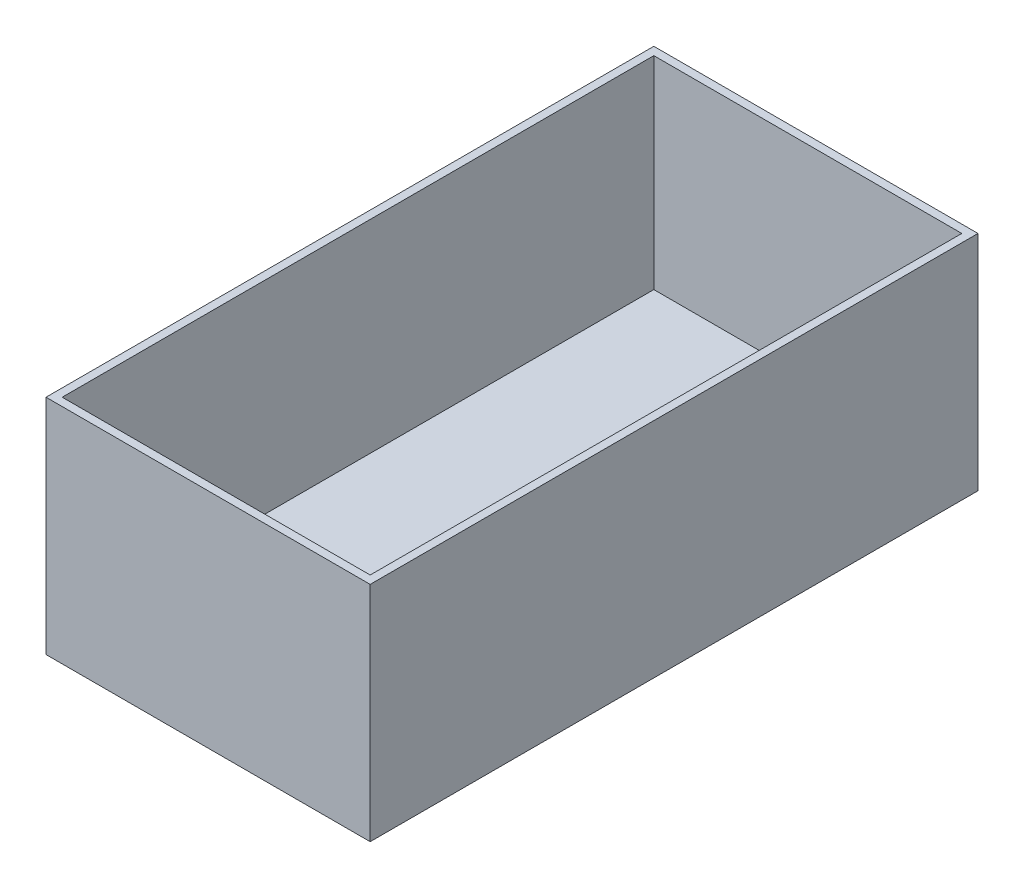
ISO-10303-21;
HEADER;
FILE_DESCRIPTION(('STEP AP214'),'2;1');
FILE_NAME('part.step','',(''),(''),'','','');
FILE_SCHEMA(('AUTOMOTIVE_DESIGN { 1 0 10303 214 1 1 1 1 }'));
ENDSEC;
DATA;
#1=APPLICATION_CONTEXT('core data for automotive mechanical design processes');
#2=APPLICATION_PROTOCOL_DEFINITION('international standard','automotive_design',2000,#1);
#3=PRODUCT_CONTEXT('',#1,'mechanical');
#4=PRODUCT('Part','Part','',(#3));
#5=PRODUCT_RELATED_PRODUCT_CATEGORY('part','',(#4));
#6=PRODUCT_DEFINITION_FORMATION('','',#4);
#7=PRODUCT_DEFINITION_CONTEXT('part definition',#1,'design');
#8=PRODUCT_DEFINITION('design','',#6,#7);
#9=PRODUCT_DEFINITION_SHAPE('','',#8);
#10=(LENGTH_UNIT() NAMED_UNIT(*) SI_UNIT(.MILLI.,.METRE.));
#11=(NAMED_UNIT(*) PLANE_ANGLE_UNIT() SI_UNIT($,.RADIAN.));
#12=(NAMED_UNIT(*) SI_UNIT($,.STERADIAN.) SOLID_ANGLE_UNIT());
#13=UNCERTAINTY_MEASURE_WITH_UNIT(LENGTH_MEASURE(1.E-05),#10,'distance_accuracy_value','');
#14=(GEOMETRIC_REPRESENTATION_CONTEXT(3) GLOBAL_UNCERTAINTY_ASSIGNED_CONTEXT((#13)) GLOBAL_UNIT_ASSIGNED_CONTEXT((#10,
#11,#12)) REPRESENTATION_CONTEXT('',''));
#15=CARTESIAN_POINT('',(0.,0.,0.));
#16=DIRECTION('',(0.,0.,1.));
#17=DIRECTION('',(1.,0.,0.));
#18=AXIS2_PLACEMENT_3D('',#15,#16,#17);
#19=CARTESIAN_POINT('',(40.,5.,-75.));
#20=DIRECTION('',(-1.,0.,0.));
#21=DIRECTION('',(0.,0.,1.));
#22=AXIS2_PLACEMENT_3D('',#19,#20,#21);
#23=PLANE('',#22);
#24=DIRECTION('',(0.,0.,-1.));
#25=VECTOR('',#24,1.);
#26=CARTESIAN_POINT('',(40.,0.,-75.));
#27=LINE('',#26,#25);
#28=CARTESIAN_POINT('',(40.,0.,75.));
#29=VERTEX_POINT('',#28);
#30=CARTESIAN_POINT('',(40.,0.,-75.));
#31=VERTEX_POINT('',#30);
#32=EDGE_CURVE('E144',#29,#31,#27,.T.);
#33=ORIENTED_EDGE('',*,*,#32,.T.);
#34=DIRECTION('',(0.,-1.,0.));
#35=VECTOR('',#34,1.);
#36=CARTESIAN_POINT('',(40.,5.,-75.));
#37=LINE('',#36,#35);
#38=CARTESIAN_POINT('',(40.,55.,-75.));
#39=VERTEX_POINT('',#38);
#40=EDGE_CURVE('E11',#39,#31,#37,.T.);
#41=ORIENTED_EDGE('',*,*,#40,.F.);
#42=DIRECTION('',(0.,0.,-1.));
#43=VECTOR('',#42,1.);
#44=CARTESIAN_POINT('',(40.,55.,-75.));
#45=LINE('',#44,#43);
#46=CARTESIAN_POINT('',(40.,55.,75.));
#47=VERTEX_POINT('',#46);
#48=EDGE_CURVE('E138',#47,#39,#45,.T.);
#49=ORIENTED_EDGE('',*,*,#48,.F.);
#50=DIRECTION('',(0.,-1.,0.));
#51=VECTOR('',#50,1.);
#52=CARTESIAN_POINT('',(40.,5.,75.));
#53=LINE('',#52,#51);
#54=EDGE_CURVE('E153',#47,#29,#53,.T.);
#55=ORIENTED_EDGE('',*,*,#54,.T.);
#56=EDGE_LOOP('',(#33,#41,#49,#55));
#57=FACE_BOUND('',#56,.T.);
#58=ADVANCED_FACE('F33',(#57),#23,.F.);
#59=CARTESIAN_POINT('',(-40.,5.,-75.));
#60=DIRECTION('',(0.,0.,1.));
#61=DIRECTION('',(1.,0.,0.));
#62=AXIS2_PLACEMENT_3D('',#59,#60,#61);
#63=PLANE('',#62);
#64=DIRECTION('',(-1.,0.,0.));
#65=VECTOR('',#64,1.);
#66=CARTESIAN_POINT('',(-40.,0.,-75.));
#67=LINE('',#66,#65);
#68=CARTESIAN_POINT('',(-40.,0.,-75.));
#69=VERTEX_POINT('',#68);
#70=EDGE_CURVE('E147',#31,#69,#67,.T.);
#71=ORIENTED_EDGE('',*,*,#70,.T.);
#72=DIRECTION('',(0.,-1.,0.));
#73=VECTOR('',#72,1.);
#74=CARTESIAN_POINT('',(-40.,5.,-75.));
#75=LINE('',#74,#73);
#76=CARTESIAN_POINT('',(-40.,55.,-75.));
#77=VERTEX_POINT('',#76);
#78=EDGE_CURVE('E40',#77,#69,#75,.T.);
#79=ORIENTED_EDGE('',*,*,#78,.F.);
#80=DIRECTION('',(-1.,0.,0.));
#81=VECTOR('',#80,1.);
#82=CARTESIAN_POINT('',(-40.,55.,-75.));
#83=LINE('',#82,#81);
#84=EDGE_CURVE('E141',#39,#77,#83,.T.);
#85=ORIENTED_EDGE('',*,*,#84,.F.);
#86=ORIENTED_EDGE('',*,*,#40,.T.);
#87=EDGE_LOOP('',(#71,#79,#85,#86));
#88=FACE_BOUND('',#87,.T.);
#89=ADVANCED_FACE('F175',(#88),#63,.F.);
#90=CARTESIAN_POINT('',(-40.,5.,-75.));
#91=DIRECTION('',(1.,0.,0.));
#92=DIRECTION('',(0.,0.,-1.));
#93=AXIS2_PLACEMENT_3D('',#90,#91,#92);
#94=PLANE('',#93);
#95=DIRECTION('',(0.,0.,1.));
#96=VECTOR('',#95,1.);
#97=CARTESIAN_POINT('',(-40.,0.,-75.));
#98=LINE('',#97,#96);
#99=CARTESIAN_POINT('',(-40.,0.,75.));
#100=VERTEX_POINT('',#99);
#101=EDGE_CURVE('E149',#69,#100,#98,.T.);
#102=ORIENTED_EDGE('',*,*,#101,.T.);
#103=DIRECTION('',(0.,-1.,0.));
#104=VECTOR('',#103,1.);
#105=CARTESIAN_POINT('',(-40.,5.,75.));
#106=LINE('',#105,#104);
#107=CARTESIAN_POINT('',(-40.,55.,75.));
#108=VERTEX_POINT('',#107);
#109=EDGE_CURVE('E156',#108,#100,#106,.T.);
#110=ORIENTED_EDGE('',*,*,#109,.F.);
#111=DIRECTION('',(0.,0.,1.));
#112=VECTOR('',#111,1.);
#113=CARTESIAN_POINT('',(-40.,55.,75.));
#114=LINE('',#113,#112);
#115=EDGE_CURVE('E111',#77,#108,#114,.T.);
#116=ORIENTED_EDGE('',*,*,#115,.F.);
#117=ORIENTED_EDGE('',*,*,#78,.T.);
#118=EDGE_LOOP('',(#102,#110,#116,#117));
#119=FACE_BOUND('',#118,.T.);
#120=ADVANCED_FACE('F162',(#119),#94,.F.);
#121=CARTESIAN_POINT('',(-40.,5.,75.));
#122=DIRECTION('',(0.,0.,-1.));
#123=DIRECTION('',(-1.,0.,0.));
#124=AXIS2_PLACEMENT_3D('',#121,#122,#123);
#125=PLANE('',#124);
#126=DIRECTION('',(1.,0.,0.));
#127=VECTOR('',#126,1.);
#128=CARTESIAN_POINT('',(-40.,0.,75.));
#129=LINE('',#128,#127);
#130=EDGE_CURVE('E151',#100,#29,#129,.T.);
#131=ORIENTED_EDGE('',*,*,#130,.T.);
#132=ORIENTED_EDGE('',*,*,#54,.F.);
#133=DIRECTION('',(1.,0.,0.));
#134=VECTOR('',#133,1.);
#135=CARTESIAN_POINT('',(40.,55.,75.));
#136=LINE('',#135,#134);
#137=EDGE_CURVE('E135',#108,#47,#136,.T.);
#138=ORIENTED_EDGE('',*,*,#137,.F.);
#139=ORIENTED_EDGE('',*,*,#109,.T.);
#140=EDGE_LOOP('',(#131,#132,#138,#139));
#141=FACE_BOUND('',#140,.T.);
#142=ADVANCED_FACE('F170',(#141),#125,.F.);
#143=CARTESIAN_POINT('',(0.,0.,0.));
#144=DIRECTION('',(0.,1.,0.));
#145=DIRECTION('',(0.,0.,1.));
#146=AXIS2_PLACEMENT_3D('',#143,#144,#145);
#147=PLANE('',#146);
#148=ORIENTED_EDGE('',*,*,#32,.F.);
#149=ORIENTED_EDGE('',*,*,#130,.F.);
#150=ORIENTED_EDGE('',*,*,#101,.F.);
#151=ORIENTED_EDGE('',*,*,#70,.F.);
#152=EDGE_LOOP('',(#148,#149,#150,#151));
#153=FACE_BOUND('',#152,.T.);
#154=ADVANCED_FACE('F168',(#153),#147,.F.);
#155=CARTESIAN_POINT('',(0.,55.,0.));
#156=DIRECTION('',(0.,-1.,0.));
#157=DIRECTION('',(0.,0.,-1.));
#158=AXIS2_PLACEMENT_3D('',#155,#156,#157);
#159=PLANE('',#158);
#160=ORIENTED_EDGE('',*,*,#115,.T.);
#161=ORIENTED_EDGE('',*,*,#137,.T.);
#162=ORIENTED_EDGE('',*,*,#48,.T.);
#163=ORIENTED_EDGE('',*,*,#84,.T.);
#164=EDGE_LOOP('',(#160,#161,#162,#163));
#165=FACE_BOUND('',#164,.T.);
#166=DIRECTION('',(-1.,0.,0.));
#167=VECTOR('',#166,1.);
#168=CARTESIAN_POINT('',(38.,55.,-73.));
#169=LINE('',#168,#167);
#170=CARTESIAN_POINT('',(38.,55.,-73.));
#171=VERTEX_POINT('',#170);
#172=CARTESIAN_POINT('',(-38.,55.,-73.));
#173=VERTEX_POINT('',#172);
#174=EDGE_CURVE('E96',#171,#173,#169,.T.);
#175=ORIENTED_EDGE('',*,*,#174,.F.);
#176=DIRECTION('',(0.,0.,-1.));
#177=VECTOR('',#176,1.);
#178=CARTESIAN_POINT('',(38.,55.,73.));
#179=LINE('',#178,#177);
#180=CARTESIAN_POINT('',(38.,55.,73.));
#181=VERTEX_POINT('',#180);
#182=EDGE_CURVE('E119',#181,#171,#179,.T.);
#183=ORIENTED_EDGE('',*,*,#182,.F.);
#184=DIRECTION('',(1.,0.,0.));
#185=VECTOR('',#184,1.);
#186=CARTESIAN_POINT('',(-38.,55.,73.));
#187=LINE('',#186,#185);
#188=CARTESIAN_POINT('',(-38.,55.,73.));
#189=VERTEX_POINT('',#188);
#190=EDGE_CURVE('E117',#189,#181,#187,.T.);
#191=ORIENTED_EDGE('',*,*,#190,.F.);
#192=DIRECTION('',(0.,0.,1.));
#193=VECTOR('',#192,1.);
#194=CARTESIAN_POINT('',(-38.,55.,-73.));
#195=LINE('',#194,#193);
#196=EDGE_CURVE('E105',#173,#189,#195,.T.);
#197=ORIENTED_EDGE('',*,*,#196,.F.);
#198=EDGE_LOOP('',(#175,#183,#191,#197));
#199=FACE_BOUND('',#198,.T.);
#200=ADVANCED_FACE('F115',(#165,#199),#159,.F.);
#201=CARTESIAN_POINT('',(38.,55.,-73.));
#202=DIRECTION('',(0.,0.,1.));
#203=DIRECTION('',(1.,0.,0.));
#204=AXIS2_PLACEMENT_3D('',#201,#202,#203);
#205=PLANE('',#204);
#206=DIRECTION('',(-1.,0.,0.));
#207=VECTOR('',#206,1.);
#208=CARTESIAN_POINT('',(38.,5.,-73.));
#209=LINE('',#208,#207);
#210=CARTESIAN_POINT('',(38.,5.,-73.));
#211=VERTEX_POINT('',#210);
#212=CARTESIAN_POINT('',(-38.,5.,-73.));
#213=VERTEX_POINT('',#212);
#214=EDGE_CURVE('E47',#211,#213,#209,.T.);
#215=ORIENTED_EDGE('',*,*,#214,.F.);
#216=DIRECTION('',(0.,-1.,0.));
#217=VECTOR('',#216,1.);
#218=CARTESIAN_POINT('',(38.,55.,-73.));
#219=LINE('',#218,#217);
#220=EDGE_CURVE('E101',#171,#211,#219,.T.);
#221=ORIENTED_EDGE('',*,*,#220,.F.);
#222=ORIENTED_EDGE('',*,*,#174,.T.);
#223=DIRECTION('',(0.,-1.,0.));
#224=VECTOR('',#223,1.);
#225=CARTESIAN_POINT('',(-38.,55.,-73.));
#226=LINE('',#225,#224);
#227=EDGE_CURVE('E99',#173,#213,#226,.T.);
#228=ORIENTED_EDGE('',*,*,#227,.T.);
#229=EDGE_LOOP('',(#215,#221,#222,#228));
#230=FACE_BOUND('',#229,.T.);
#231=ADVANCED_FACE('F98',(#230),#205,.T.);
#232=CARTESIAN_POINT('',(-38.,55.,-73.));
#233=DIRECTION('',(1.,0.,0.));
#234=DIRECTION('',(0.,0.,-1.));
#235=AXIS2_PLACEMENT_3D('',#232,#233,#234);
#236=PLANE('',#235);
#237=DIRECTION('',(0.,0.,1.));
#238=VECTOR('',#237,1.);
#239=CARTESIAN_POINT('',(-38.,5.,-73.));
#240=LINE('',#239,#238);
#241=CARTESIAN_POINT('',(-38.,5.,73.));
#242=VERTEX_POINT('',#241);
#243=EDGE_CURVE('E51',#213,#242,#240,.T.);
#244=ORIENTED_EDGE('',*,*,#243,.F.);
#245=ORIENTED_EDGE('',*,*,#227,.F.);
#246=ORIENTED_EDGE('',*,*,#196,.T.);
#247=DIRECTION('',(0.,-1.,0.));
#248=VECTOR('',#247,1.);
#249=CARTESIAN_POINT('',(-38.,55.,73.));
#250=LINE('',#249,#248);
#251=EDGE_CURVE('E112',#189,#242,#250,.T.);
#252=ORIENTED_EDGE('',*,*,#251,.T.);
#253=EDGE_LOOP('',(#244,#245,#246,#252));
#254=FACE_BOUND('',#253,.T.);
#255=ADVANCED_FACE('F109',(#254),#236,.T.);
#256=CARTESIAN_POINT('',(-38.,55.,73.));
#257=DIRECTION('',(0.,0.,-1.));
#258=DIRECTION('',(-1.,0.,0.));
#259=AXIS2_PLACEMENT_3D('',#256,#257,#258);
#260=PLANE('',#259);
#261=DIRECTION('',(1.,0.,0.));
#262=VECTOR('',#261,1.);
#263=CARTESIAN_POINT('',(-38.,5.,73.));
#264=LINE('',#263,#262);
#265=CARTESIAN_POINT('',(38.,5.,73.));
#266=VERTEX_POINT('',#265);
#267=EDGE_CURVE('E125',#242,#266,#264,.T.);
#268=ORIENTED_EDGE('',*,*,#267,.F.);
#269=ORIENTED_EDGE('',*,*,#251,.F.);
#270=ORIENTED_EDGE('',*,*,#190,.T.);
#271=DIRECTION('',(0.,-1.,0.));
#272=VECTOR('',#271,1.);
#273=CARTESIAN_POINT('',(38.,55.,73.));
#274=LINE('',#273,#272);
#275=EDGE_CURVE('E129',#181,#266,#274,.T.);
#276=ORIENTED_EDGE('',*,*,#275,.T.);
#277=EDGE_LOOP('',(#268,#269,#270,#276));
#278=FACE_BOUND('',#277,.T.);
#279=ADVANCED_FACE('F197',(#278),#260,.T.);
#280=CARTESIAN_POINT('',(38.,55.,73.));
#281=DIRECTION('',(-1.,0.,0.));
#282=DIRECTION('',(0.,0.,1.));
#283=AXIS2_PLACEMENT_3D('',#280,#281,#282);
#284=PLANE('',#283);
#285=DIRECTION('',(0.,0.,-1.));
#286=VECTOR('',#285,1.);
#287=CARTESIAN_POINT('',(38.,5.,73.));
#288=LINE('',#287,#286);
#289=EDGE_CURVE('E106',#266,#211,#288,.T.);
#290=ORIENTED_EDGE('',*,*,#289,.F.);
#291=ORIENTED_EDGE('',*,*,#275,.F.);
#292=ORIENTED_EDGE('',*,*,#182,.T.);
#293=ORIENTED_EDGE('',*,*,#220,.T.);
#294=EDGE_LOOP('',(#290,#291,#292,#293));
#295=FACE_BOUND('',#294,.T.);
#296=ADVANCED_FACE('F190',(#295),#284,.T.);
#297=CARTESIAN_POINT('',(0.,5.,0.));
#298=DIRECTION('',(0.,1.,0.));
#299=DIRECTION('',(0.,0.,1.));
#300=AXIS2_PLACEMENT_3D('',#297,#298,#299);
#301=PLANE('',#300);
#302=ORIENTED_EDGE('',*,*,#214,.T.);
#303=ORIENTED_EDGE('',*,*,#243,.T.);
#304=ORIENTED_EDGE('',*,*,#267,.T.);
#305=ORIENTED_EDGE('',*,*,#289,.T.);
#306=EDGE_LOOP('',(#302,#303,#304,#305));
#307=FACE_BOUND('',#306,.T.);
#308=ADVANCED_FACE('F187',(#307),#301,.T.);
#309=CLOSED_SHELL('',(#58,#89,#120,#142,#154,#200,#231,#255,#279,#296,#308));
#310=MANIFOLD_SOLID_BREP('B2',#309);
#311=ADVANCED_BREP_SHAPE_REPRESENTATION('',(#18,#310),#14);
#312=SHAPE_DEFINITION_REPRESENTATION(#9,#311);
ENDSEC;
END-ISO-10303-21;
